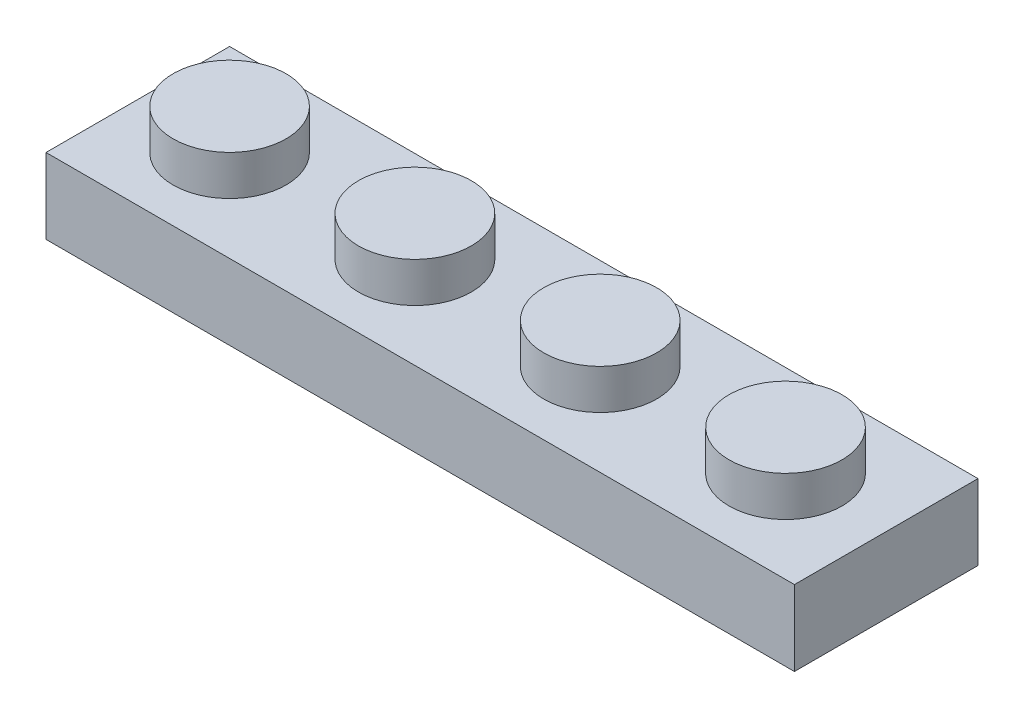
ISO-10303-21;
HEADER;
FILE_DESCRIPTION(('STEP AP214'),'2;1');
FILE_NAME('part.step','',(''),(''),'','','');
FILE_SCHEMA(('AUTOMOTIVE_DESIGN { 1 0 10303 214 1 1 1 1 }'));
ENDSEC;
DATA;
#1=APPLICATION_CONTEXT('core data for automotive mechanical design processes');
#2=APPLICATION_PROTOCOL_DEFINITION('international standard','automotive_design',2000,#1);
#3=PRODUCT_CONTEXT('',#1,'mechanical');
#4=PRODUCT('Part','Part','',(#3));
#5=PRODUCT_RELATED_PRODUCT_CATEGORY('part','',(#4));
#6=PRODUCT_DEFINITION_FORMATION('','',#4);
#7=PRODUCT_DEFINITION_CONTEXT('part definition',#1,'design');
#8=PRODUCT_DEFINITION('design','',#6,#7);
#9=PRODUCT_DEFINITION_SHAPE('','',#8);
#10=(LENGTH_UNIT() NAMED_UNIT(*) SI_UNIT(.MILLI.,.METRE.));
#11=(NAMED_UNIT(*) PLANE_ANGLE_UNIT() SI_UNIT($,.RADIAN.));
#12=(NAMED_UNIT(*) SI_UNIT($,.STERADIAN.) SOLID_ANGLE_UNIT());
#13=UNCERTAINTY_MEASURE_WITH_UNIT(LENGTH_MEASURE(1.E-05),#10,'distance_accuracy_value','');
#14=(GEOMETRIC_REPRESENTATION_CONTEXT(3) GLOBAL_UNCERTAINTY_ASSIGNED_CONTEXT((#13)) GLOBAL_UNIT_ASSIGNED_CONTEXT((#10,
#11,#12)) REPRESENTATION_CONTEXT('',''));
#15=CARTESIAN_POINT('',(0.,0.,0.));
#16=DIRECTION('',(0.,0.,1.));
#17=DIRECTION('',(1.,0.,0.));
#18=AXIS2_PLACEMENT_3D('',#15,#16,#17);
#19=CARTESIAN_POINT('',(-15.9,3.2,3.9));
#20=DIRECTION('',(1.,0.,0.));
#21=DIRECTION('',(0.,0.,-1.));
#22=AXIS2_PLACEMENT_3D('',#19,#20,#21);
#23=PLANE('',#22);
#24=DIRECTION('',(0.,0.,1.));
#25=VECTOR('',#24,1.);
#26=CARTESIAN_POINT('',(-15.9,0.,3.9));
#27=LINE('',#26,#25);
#28=CARTESIAN_POINT('',(-15.9,0.,-3.9));
#29=VERTEX_POINT('',#28);
#30=CARTESIAN_POINT('',(-15.9,0.,3.9));
#31=VERTEX_POINT('',#30);
#32=EDGE_CURVE('E96',#29,#31,#27,.T.);
#33=ORIENTED_EDGE('',*,*,#32,.T.);
#34=DIRECTION('',(0.,-1.,0.));
#35=VECTOR('',#34,1.);
#36=CARTESIAN_POINT('',(-15.9,3.2,3.9));
#37=LINE('',#36,#35);
#38=CARTESIAN_POINT('',(-15.9,3.2,3.9));
#39=VERTEX_POINT('',#38);
#40=EDGE_CURVE('E11',#39,#31,#37,.T.);
#41=ORIENTED_EDGE('',*,*,#40,.F.);
#42=DIRECTION('',(0.,0.,1.));
#43=VECTOR('',#42,1.);
#44=CARTESIAN_POINT('',(-15.9,3.2,3.9));
#45=LINE('',#44,#43);
#46=CARTESIAN_POINT('',(-15.9,3.2,-3.9));
#47=VERTEX_POINT('',#46);
#48=EDGE_CURVE('E84',#47,#39,#45,.T.);
#49=ORIENTED_EDGE('',*,*,#48,.F.);
#50=DIRECTION('',(0.,-1.,0.));
#51=VECTOR('',#50,1.);
#52=CARTESIAN_POINT('',(-15.9,3.2,-3.9));
#53=LINE('',#52,#51);
#54=EDGE_CURVE('E92',#47,#29,#53,.T.);
#55=ORIENTED_EDGE('',*,*,#54,.T.);
#56=EDGE_LOOP('',(#33,#41,#49,#55));
#57=FACE_BOUND('',#56,.T.);
#58=ADVANCED_FACE('F33',(#57),#23,.F.);
#59=CARTESIAN_POINT('',(15.9,3.2,3.9));
#60=DIRECTION('',(0.,0.,-1.));
#61=DIRECTION('',(-1.,0.,0.));
#62=AXIS2_PLACEMENT_3D('',#59,#60,#61);
#63=PLANE('',#62);
#64=DIRECTION('',(1.,0.,0.));
#65=VECTOR('',#64,1.);
#66=CARTESIAN_POINT('',(15.9,0.,3.9));
#67=LINE('',#66,#65);
#68=CARTESIAN_POINT('',(15.9,0.,3.9));
#69=VERTEX_POINT('',#68);
#70=EDGE_CURVE('E88',#31,#69,#67,.T.);
#71=ORIENTED_EDGE('',*,*,#70,.T.);
#72=DIRECTION('',(0.,-1.,0.));
#73=VECTOR('',#72,1.);
#74=CARTESIAN_POINT('',(15.9,3.2,3.9));
#75=LINE('',#74,#73);
#76=CARTESIAN_POINT('',(15.9,3.2,3.9));
#77=VERTEX_POINT('',#76);
#78=EDGE_CURVE('E41',#77,#69,#75,.T.);
#79=ORIENTED_EDGE('',*,*,#78,.F.);
#80=DIRECTION('',(1.,0.,0.));
#81=VECTOR('',#80,1.);
#82=CARTESIAN_POINT('',(15.9,3.2,3.9));
#83=LINE('',#82,#81);
#84=EDGE_CURVE('E79',#39,#77,#83,.T.);
#85=ORIENTED_EDGE('',*,*,#84,.F.);
#86=ORIENTED_EDGE('',*,*,#40,.T.);
#87=EDGE_LOOP('',(#71,#79,#85,#86));
#88=FACE_BOUND('',#87,.T.);
#89=ADVANCED_FACE('F87',(#88),#63,.F.);
#90=CARTESIAN_POINT('',(15.9,3.2,3.9));
#91=DIRECTION('',(-1.,0.,0.));
#92=DIRECTION('',(0.,0.,1.));
#93=AXIS2_PLACEMENT_3D('',#90,#91,#92);
#94=PLANE('',#93);
#95=DIRECTION('',(0.,0.,-1.));
#96=VECTOR('',#95,1.);
#97=CARTESIAN_POINT('',(15.9,0.,3.9));
#98=LINE('',#97,#96);
#99=CARTESIAN_POINT('',(15.9,0.,-3.9));
#100=VERTEX_POINT('',#99);
#101=EDGE_CURVE('E66',#69,#100,#98,.T.);
#102=ORIENTED_EDGE('',*,*,#101,.T.);
#103=DIRECTION('',(0.,-1.,0.));
#104=VECTOR('',#103,1.);
#105=CARTESIAN_POINT('',(15.9,3.2,-3.9));
#106=LINE('',#105,#104);
#107=CARTESIAN_POINT('',(15.9,3.2,-3.9));
#108=VERTEX_POINT('',#107);
#109=EDGE_CURVE('E89',#108,#100,#106,.T.);
#110=ORIENTED_EDGE('',*,*,#109,.F.);
#111=DIRECTION('',(0.,0.,-1.));
#112=VECTOR('',#111,1.);
#113=CARTESIAN_POINT('',(15.9,3.2,3.9));
#114=LINE('',#113,#112);
#115=EDGE_CURVE('E82',#77,#108,#114,.T.);
#116=ORIENTED_EDGE('',*,*,#115,.F.);
#117=ORIENTED_EDGE('',*,*,#78,.T.);
#118=EDGE_LOOP('',(#102,#110,#116,#117));
#119=FACE_BOUND('',#118,.T.);
#120=ADVANCED_FACE('F90',(#119),#94,.F.);
#121=CARTESIAN_POINT('',(15.9,3.2,-3.9));
#122=DIRECTION('',(0.,0.,1.));
#123=DIRECTION('',(1.,0.,0.));
#124=AXIS2_PLACEMENT_3D('',#121,#122,#123);
#125=PLANE('',#124);
#126=DIRECTION('',(-1.,0.,0.));
#127=VECTOR('',#126,1.);
#128=CARTESIAN_POINT('',(15.9,0.,-3.9));
#129=LINE('',#128,#127);
#130=EDGE_CURVE('E72',#100,#29,#129,.T.);
#131=ORIENTED_EDGE('',*,*,#130,.T.);
#132=ORIENTED_EDGE('',*,*,#54,.F.);
#133=DIRECTION('',(-1.,0.,0.));
#134=VECTOR('',#133,1.);
#135=CARTESIAN_POINT('',(15.9,3.2,-3.9));
#136=LINE('',#135,#134);
#137=EDGE_CURVE('E49',#108,#47,#136,.T.);
#138=ORIENTED_EDGE('',*,*,#137,.F.);
#139=ORIENTED_EDGE('',*,*,#109,.T.);
#140=EDGE_LOOP('',(#131,#132,#138,#139));
#141=FACE_BOUND('',#140,.T.);
#142=ADVANCED_FACE('F104',(#141),#125,.F.);
#143=CARTESIAN_POINT('',(0.,3.2,0.));
#144=DIRECTION('',(0.,1.,0.));
#145=DIRECTION('',(0.,0.,1.));
#146=AXIS2_PLACEMENT_3D('',#143,#144,#145);
#147=PLANE('',#146);
#148=CARTESIAN_POINT('',(11.622,3.2,0.));
#149=DIRECTION('',(0.,1.,0.));
#150=DIRECTION('',(0.,0.,1.));
#151=AXIS2_PLACEMENT_3D('',#148,#149,#150);
#152=CIRCLE('',#151,2.4);
#153=CARTESIAN_POINT('',(11.622,3.2,2.4));
#154=VERTEX_POINT('',#153);
#155=EDGE_CURVE('E128',#154,#154,#152,.T.);
#156=ORIENTED_EDGE('',*,*,#155,.F.);
#157=EDGE_LOOP('',(#156));
#158=FACE_BOUND('',#157,.T.);
#159=CARTESIAN_POINT('',(3.74799999999999,3.2,0.));
#160=DIRECTION('',(0.,1.,0.));
#161=DIRECTION('',(0.,0.,1.));
#162=AXIS2_PLACEMENT_3D('',#159,#160,#161);
#163=CIRCLE('',#162,2.4);
#164=CARTESIAN_POINT('',(3.74799999999999,3.2,2.4));
#165=VERTEX_POINT('',#164);
#166=EDGE_CURVE('E122',#165,#165,#163,.T.);
#167=ORIENTED_EDGE('',*,*,#166,.F.);
#168=EDGE_LOOP('',(#167));
#169=FACE_BOUND('',#168,.T.);
#170=CARTESIAN_POINT('',(-4.12600000000001,3.2,0.));
#171=DIRECTION('',(0.,1.,0.));
#172=DIRECTION('',(0.,0.,1.));
#173=AXIS2_PLACEMENT_3D('',#170,#171,#172);
#174=CIRCLE('',#173,2.4);
#175=CARTESIAN_POINT('',(-4.12600000000001,3.2,2.4));
#176=VERTEX_POINT('',#175);
#177=EDGE_CURVE('E116',#176,#176,#174,.T.);
#178=ORIENTED_EDGE('',*,*,#177,.F.);
#179=EDGE_LOOP('',(#178));
#180=FACE_BOUND('',#179,.T.);
#181=CARTESIAN_POINT('',(-12.,3.2,0.));
#182=DIRECTION('',(0.,1.,0.));
#183=DIRECTION('',(0.,0.,1.));
#184=AXIS2_PLACEMENT_3D('',#181,#182,#183);
#185=CIRCLE('',#184,2.4);
#186=CARTESIAN_POINT('',(-12.,3.2,2.4));
#187=VERTEX_POINT('',#186);
#188=EDGE_CURVE('E110',#187,#187,#185,.T.);
#189=ORIENTED_EDGE('',*,*,#188,.F.);
#190=EDGE_LOOP('',(#189));
#191=FACE_BOUND('',#190,.T.);
#192=ORIENTED_EDGE('',*,*,#48,.T.);
#193=ORIENTED_EDGE('',*,*,#84,.T.);
#194=ORIENTED_EDGE('',*,*,#115,.T.);
#195=ORIENTED_EDGE('',*,*,#137,.T.);
#196=EDGE_LOOP('',(#192,#193,#194,#195));
#197=FACE_BOUND('',#196,.T.);
#198=ADVANCED_FACE('F80',(#158,#169,#180,#191,#197),#147,.T.);
#199=CARTESIAN_POINT('',(0.,0.,0.));
#200=DIRECTION('',(0.,1.,0.));
#201=DIRECTION('',(0.,0.,1.));
#202=AXIS2_PLACEMENT_3D('',#199,#200,#201);
#203=PLANE('',#202);
#204=CARTESIAN_POINT('',(-12.,0.,0.));
#205=DIRECTION('',(0.,-1.,0.));
#206=DIRECTION('',(0.,0.,-1.));
#207=AXIS2_PLACEMENT_3D('',#204,#205,#206);
#208=CIRCLE('',#207,2.5);
#209=CARTESIAN_POINT('',(-12.,0.,-2.5));
#210=VERTEX_POINT('',#209);
#211=EDGE_CURVE('E152',#210,#210,#208,.T.);
#212=ORIENTED_EDGE('',*,*,#211,.F.);
#213=EDGE_LOOP('',(#212));
#214=FACE_BOUND('',#213,.T.);
#215=CARTESIAN_POINT('',(-4.12600000000001,0.,0.));
#216=DIRECTION('',(0.,-1.,0.));
#217=DIRECTION('',(0.,0.,-1.));
#218=AXIS2_PLACEMENT_3D('',#215,#216,#217);
#219=CIRCLE('',#218,2.5);
#220=CARTESIAN_POINT('',(-4.12600000000001,0.,-2.5));
#221=VERTEX_POINT('',#220);
#222=EDGE_CURVE('E146',#221,#221,#219,.T.);
#223=ORIENTED_EDGE('',*,*,#222,.F.);
#224=EDGE_LOOP('',(#223));
#225=FACE_BOUND('',#224,.T.);
#226=CARTESIAN_POINT('',(3.74799999999999,0.,0.));
#227=DIRECTION('',(0.,-1.,0.));
#228=DIRECTION('',(0.,0.,-1.));
#229=AXIS2_PLACEMENT_3D('',#226,#227,#228);
#230=CIRCLE('',#229,2.5);
#231=CARTESIAN_POINT('',(3.74799999999999,0.,-2.5));
#232=VERTEX_POINT('',#231);
#233=EDGE_CURVE('E140',#232,#232,#230,.T.);
#234=ORIENTED_EDGE('',*,*,#233,.F.);
#235=EDGE_LOOP('',(#234));
#236=FACE_BOUND('',#235,.T.);
#237=CARTESIAN_POINT('',(11.622,0.,0.));
#238=DIRECTION('',(0.,-1.,0.));
#239=DIRECTION('',(0.,0.,-1.));
#240=AXIS2_PLACEMENT_3D('',#237,#238,#239);
#241=CIRCLE('',#240,2.5);
#242=CARTESIAN_POINT('',(11.622,0.,-2.5));
#243=VERTEX_POINT('',#242);
#244=EDGE_CURVE('E134',#243,#243,#241,.T.);
#245=ORIENTED_EDGE('',*,*,#244,.F.);
#246=EDGE_LOOP('',(#245));
#247=FACE_BOUND('',#246,.T.);
#248=ORIENTED_EDGE('',*,*,#32,.F.);
#249=ORIENTED_EDGE('',*,*,#130,.F.);
#250=ORIENTED_EDGE('',*,*,#101,.F.);
#251=ORIENTED_EDGE('',*,*,#70,.F.);
#252=EDGE_LOOP('',(#248,#249,#250,#251));
#253=FACE_BOUND('',#252,.T.);
#254=ADVANCED_FACE('F107',(#214,#225,#236,#247,#253),#203,.F.);
#255=CARTESIAN_POINT('',(-12.,4.9,0.));
#256=DIRECTION('',(0.,-1.,0.));
#257=DIRECTION('',(0.,0.,-1.));
#258=AXIS2_PLACEMENT_3D('',#255,#256,#257);
#259=CYLINDRICAL_SURFACE('',#258,2.4);
#260=CARTESIAN_POINT('',(-12.,4.9,0.));
#261=DIRECTION('',(0.,1.,0.));
#262=DIRECTION('',(0.,0.,1.));
#263=AXIS2_PLACEMENT_3D('',#260,#261,#262);
#264=CIRCLE('',#263,2.4);
#265=CARTESIAN_POINT('',(-12.,4.9,2.4));
#266=VERTEX_POINT('',#265);
#267=EDGE_CURVE('E99',#266,#266,#264,.T.);
#268=ORIENTED_EDGE('',*,*,#267,.F.);
#269=EDGE_LOOP('',(#268));
#270=FACE_BOUND('',#269,.T.);
#271=ORIENTED_EDGE('',*,*,#188,.T.);
#272=EDGE_LOOP('',(#271));
#273=FACE_BOUND('',#272,.T.);
#274=ADVANCED_FACE('F169',(#270,#273),#259,.T.);
#275=CARTESIAN_POINT('',(-12.,4.9,0.));
#276=DIRECTION('',(0.,1.,0.));
#277=DIRECTION('',(0.,0.,1.));
#278=AXIS2_PLACEMENT_3D('',#275,#276,#277);
#279=PLANE('',#278);
#280=ORIENTED_EDGE('',*,*,#267,.T.);
#281=EDGE_LOOP('',(#280));
#282=FACE_BOUND('',#281,.T.);
#283=ADVANCED_FACE('F210',(#282),#279,.T.);
#284=CARTESIAN_POINT('',(-4.12600000000001,4.9,0.));
#285=DIRECTION('',(0.,-1.,0.));
#286=DIRECTION('',(0.,0.,-1.));
#287=AXIS2_PLACEMENT_3D('',#284,#285,#286);
#288=CYLINDRICAL_SURFACE('',#287,2.4);
#289=CARTESIAN_POINT('',(-4.12600000000001,4.9,0.));
#290=DIRECTION('',(0.,1.,0.));
#291=DIRECTION('',(0.,0.,1.));
#292=AXIS2_PLACEMENT_3D('',#289,#290,#291);
#293=CIRCLE('',#292,2.4);
#294=CARTESIAN_POINT('',(-4.12600000000001,4.9,2.4));
#295=VERTEX_POINT('',#294);
#296=EDGE_CURVE('E113',#295,#295,#293,.T.);
#297=ORIENTED_EDGE('',*,*,#296,.F.);
#298=EDGE_LOOP('',(#297));
#299=FACE_BOUND('',#298,.T.);
#300=ORIENTED_EDGE('',*,*,#177,.T.);
#301=EDGE_LOOP('',(#300));
#302=FACE_BOUND('',#301,.T.);
#303=ADVANCED_FACE('F214',(#299,#302),#288,.T.);
#304=CARTESIAN_POINT('',(-4.12600000000001,4.9,0.));
#305=DIRECTION('',(0.,1.,0.));
#306=DIRECTION('',(0.,0.,1.));
#307=AXIS2_PLACEMENT_3D('',#304,#305,#306);
#308=PLANE('',#307);
#309=ORIENTED_EDGE('',*,*,#296,.T.);
#310=EDGE_LOOP('',(#309));
#311=FACE_BOUND('',#310,.T.);
#312=ADVANCED_FACE('F218',(#311),#308,.T.);
#313=CARTESIAN_POINT('',(3.74799999999999,4.9,0.));
#314=DIRECTION('',(0.,-1.,0.));
#315=DIRECTION('',(0.,0.,-1.));
#316=AXIS2_PLACEMENT_3D('',#313,#314,#315);
#317=CYLINDRICAL_SURFACE('',#316,2.4);
#318=CARTESIAN_POINT('',(3.74799999999999,4.9,0.));
#319=DIRECTION('',(0.,1.,0.));
#320=DIRECTION('',(0.,0.,1.));
#321=AXIS2_PLACEMENT_3D('',#318,#319,#320);
#322=CIRCLE('',#321,2.4);
#323=CARTESIAN_POINT('',(3.74799999999999,4.9,2.4));
#324=VERTEX_POINT('',#323);
#325=EDGE_CURVE('E119',#324,#324,#322,.T.);
#326=ORIENTED_EDGE('',*,*,#325,.F.);
#327=EDGE_LOOP('',(#326));
#328=FACE_BOUND('',#327,.T.);
#329=ORIENTED_EDGE('',*,*,#166,.T.);
#330=EDGE_LOOP('',(#329));
#331=FACE_BOUND('',#330,.T.);
#332=ADVANCED_FACE('F222',(#328,#331),#317,.T.);
#333=CARTESIAN_POINT('',(3.74799999999999,4.9,0.));
#334=DIRECTION('',(0.,1.,0.));
#335=DIRECTION('',(0.,0.,1.));
#336=AXIS2_PLACEMENT_3D('',#333,#334,#335);
#337=PLANE('',#336);
#338=ORIENTED_EDGE('',*,*,#325,.T.);
#339=EDGE_LOOP('',(#338));
#340=FACE_BOUND('',#339,.T.);
#341=ADVANCED_FACE('F226',(#340),#337,.T.);
#342=CARTESIAN_POINT('',(11.622,4.9,0.));
#343=DIRECTION('',(0.,-1.,0.));
#344=DIRECTION('',(0.,0.,-1.));
#345=AXIS2_PLACEMENT_3D('',#342,#343,#344);
#346=CYLINDRICAL_SURFACE('',#345,2.4);
#347=CARTESIAN_POINT('',(11.622,4.9,0.));
#348=DIRECTION('',(0.,1.,0.));
#349=DIRECTION('',(0.,0.,1.));
#350=AXIS2_PLACEMENT_3D('',#347,#348,#349);
#351=CIRCLE('',#350,2.4);
#352=CARTESIAN_POINT('',(11.622,4.9,2.4));
#353=VERTEX_POINT('',#352);
#354=EDGE_CURVE('E125',#353,#353,#351,.T.);
#355=ORIENTED_EDGE('',*,*,#354,.F.);
#356=EDGE_LOOP('',(#355));
#357=FACE_BOUND('',#356,.T.);
#358=ORIENTED_EDGE('',*,*,#155,.T.);
#359=EDGE_LOOP('',(#358));
#360=FACE_BOUND('',#359,.T.);
#361=ADVANCED_FACE('F190',(#357,#360),#346,.T.);
#362=CARTESIAN_POINT('',(11.622,4.9,0.));
#363=DIRECTION('',(0.,1.,0.));
#364=DIRECTION('',(0.,0.,1.));
#365=AXIS2_PLACEMENT_3D('',#362,#363,#364);
#366=PLANE('',#365);
#367=ORIENTED_EDGE('',*,*,#354,.T.);
#368=EDGE_LOOP('',(#367));
#369=FACE_BOUND('',#368,.T.);
#370=ADVANCED_FACE('F180',(#369),#366,.T.);
#371=CARTESIAN_POINT('',(11.622,1.8,0.));
#372=DIRECTION('',(0.,-1.,0.));
#373=DIRECTION('',(0.,0.,-1.));
#374=AXIS2_PLACEMENT_3D('',#371,#372,#373);
#375=CYLINDRICAL_SURFACE('',#374,2.5);
#376=CARTESIAN_POINT('',(11.622,1.8,0.));
#377=DIRECTION('',(0.,-1.,0.));
#378=DIRECTION('',(0.,0.,-1.));
#379=AXIS2_PLACEMENT_3D('',#376,#377,#378);
#380=CIRCLE('',#379,2.5);
#381=CARTESIAN_POINT('',(11.622,1.8,-2.5));
#382=VERTEX_POINT('',#381);
#383=EDGE_CURVE('E137',#382,#382,#380,.T.);
#384=ORIENTED_EDGE('',*,*,#383,.F.);
#385=EDGE_LOOP('',(#384));
#386=FACE_BOUND('',#385,.T.);
#387=ORIENTED_EDGE('',*,*,#244,.T.);
#388=EDGE_LOOP('',(#387));
#389=FACE_BOUND('',#388,.T.);
#390=ADVANCED_FACE('F177',(#386,#389),#375,.F.);
#391=CARTESIAN_POINT('',(11.622,1.8,0.));
#392=DIRECTION('',(0.,-1.,0.));
#393=DIRECTION('',(0.,0.,-1.));
#394=AXIS2_PLACEMENT_3D('',#391,#392,#393);
#395=PLANE('',#394);
#396=ORIENTED_EDGE('',*,*,#383,.T.);
#397=EDGE_LOOP('',(#396));
#398=FACE_BOUND('',#397,.T.);
#399=ADVANCED_FACE('F179',(#398),#395,.T.);
#400=CARTESIAN_POINT('',(3.74799999999999,1.8,0.));
#401=DIRECTION('',(0.,-1.,0.));
#402=DIRECTION('',(0.,0.,-1.));
#403=AXIS2_PLACEMENT_3D('',#400,#401,#402);
#404=CYLINDRICAL_SURFACE('',#403,2.5);
#405=CARTESIAN_POINT('',(3.74799999999999,1.8,0.));
#406=DIRECTION('',(0.,-1.,0.));
#407=DIRECTION('',(0.,0.,-1.));
#408=AXIS2_PLACEMENT_3D('',#405,#406,#407);
#409=CIRCLE('',#408,2.5);
#410=CARTESIAN_POINT('',(3.74799999999999,1.8,-2.5));
#411=VERTEX_POINT('',#410);
#412=EDGE_CURVE('E143',#411,#411,#409,.T.);
#413=ORIENTED_EDGE('',*,*,#412,.F.);
#414=EDGE_LOOP('',(#413));
#415=FACE_BOUND('',#414,.T.);
#416=ORIENTED_EDGE('',*,*,#233,.T.);
#417=EDGE_LOOP('',(#416));
#418=FACE_BOUND('',#417,.T.);
#419=ADVANCED_FACE('F187',(#415,#418),#404,.F.);
#420=CARTESIAN_POINT('',(3.74799999999999,1.8,0.));
#421=DIRECTION('',(0.,-1.,0.));
#422=DIRECTION('',(0.,0.,-1.));
#423=AXIS2_PLACEMENT_3D('',#420,#421,#422);
#424=PLANE('',#423);
#425=ORIENTED_EDGE('',*,*,#412,.T.);
#426=EDGE_LOOP('',(#425));
#427=FACE_BOUND('',#426,.T.);
#428=ADVANCED_FACE('F280',(#427),#424,.T.);
#429=CARTESIAN_POINT('',(-4.12600000000001,1.8,0.));
#430=DIRECTION('',(0.,-1.,0.));
#431=DIRECTION('',(0.,0.,-1.));
#432=AXIS2_PLACEMENT_3D('',#429,#430,#431);
#433=CYLINDRICAL_SURFACE('',#432,2.5);
#434=CARTESIAN_POINT('',(-4.12600000000001,1.8,0.));
#435=DIRECTION('',(0.,-1.,0.));
#436=DIRECTION('',(0.,0.,-1.));
#437=AXIS2_PLACEMENT_3D('',#434,#435,#436);
#438=CIRCLE('',#437,2.5);
#439=CARTESIAN_POINT('',(-4.12600000000001,1.8,-2.5));
#440=VERTEX_POINT('',#439);
#441=EDGE_CURVE('E149',#440,#440,#438,.T.);
#442=ORIENTED_EDGE('',*,*,#441,.F.);
#443=EDGE_LOOP('',(#442));
#444=FACE_BOUND('',#443,.T.);
#445=ORIENTED_EDGE('',*,*,#222,.T.);
#446=EDGE_LOOP('',(#445));
#447=FACE_BOUND('',#446,.T.);
#448=ADVANCED_FACE('F290',(#444,#447),#433,.F.);
#449=CARTESIAN_POINT('',(-4.12600000000001,1.8,0.));
#450=DIRECTION('',(0.,-1.,0.));
#451=DIRECTION('',(0.,0.,-1.));
#452=AXIS2_PLACEMENT_3D('',#449,#450,#451);
#453=PLANE('',#452);
#454=ORIENTED_EDGE('',*,*,#441,.T.);
#455=EDGE_LOOP('',(#454));
#456=FACE_BOUND('',#455,.T.);
#457=ADVANCED_FACE('F163',(#456),#453,.T.);
#458=CARTESIAN_POINT('',(-12.,1.8,0.));
#459=DIRECTION('',(0.,-1.,0.));
#460=DIRECTION('',(0.,0.,-1.));
#461=AXIS2_PLACEMENT_3D('',#458,#459,#460);
#462=CYLINDRICAL_SURFACE('',#461,2.5);
#463=CARTESIAN_POINT('',(-12.,1.8,0.));
#464=DIRECTION('',(0.,-1.,0.));
#465=DIRECTION('',(0.,0.,-1.));
#466=AXIS2_PLACEMENT_3D('',#463,#464,#465);
#467=CIRCLE('',#466,2.5);
#468=CARTESIAN_POINT('',(-12.,1.8,-2.5));
#469=VERTEX_POINT('',#468);
#470=EDGE_CURVE('E131',#469,#469,#467,.T.);
#471=ORIENTED_EDGE('',*,*,#470,.F.);
#472=EDGE_LOOP('',(#471));
#473=FACE_BOUND('',#472,.T.);
#474=ORIENTED_EDGE('',*,*,#211,.T.);
#475=EDGE_LOOP('',(#474));
#476=FACE_BOUND('',#475,.T.);
#477=ADVANCED_FACE('F160',(#473,#476),#462,.F.);
#478=CARTESIAN_POINT('',(-12.,1.8,0.));
#479=DIRECTION('',(0.,-1.,0.));
#480=DIRECTION('',(0.,0.,-1.));
#481=AXIS2_PLACEMENT_3D('',#478,#479,#480);
#482=PLANE('',#481);
#483=ORIENTED_EDGE('',*,*,#470,.T.);
#484=EDGE_LOOP('',(#483));
#485=FACE_BOUND('',#484,.T.);
#486=ADVANCED_FACE('F158',(#485),#482,.T.);
#487=CLOSED_SHELL('',(#58,#89,#120,#142,#198,#254,#274,#283,#303,#312,#332,#341,#361,#370,#390,
#399,#419,#428,#448,#457,#477,#486));
#488=MANIFOLD_SOLID_BREP('B2',#487);
#489=ADVANCED_BREP_SHAPE_REPRESENTATION('',(#18,#488),#14);
#490=SHAPE_DEFINITION_REPRESENTATION(#9,#489);
ENDSEC;
END-ISO-10303-21;
